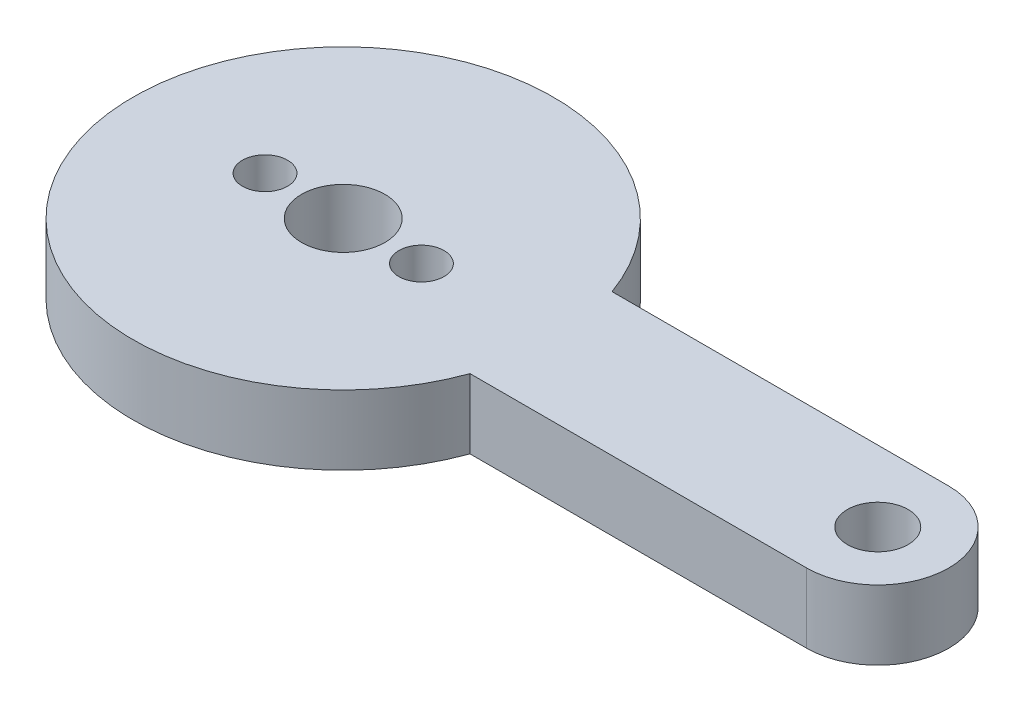
ISO-10303-21;
HEADER;
FILE_DESCRIPTION(('STEP AP214'),'2;1');
FILE_NAME('part.step','',(''),(''),'','','');
FILE_SCHEMA(('AUTOMOTIVE_DESIGN { 1 0 10303 214 1 1 1 1 }'));
ENDSEC;
DATA;
#1=APPLICATION_CONTEXT('core data for automotive mechanical design processes');
#2=APPLICATION_PROTOCOL_DEFINITION('international standard','automotive_design',2000,#1);
#3=PRODUCT_CONTEXT('',#1,'mechanical');
#4=PRODUCT('Part','Part','',(#3));
#5=PRODUCT_RELATED_PRODUCT_CATEGORY('part','',(#4));
#6=PRODUCT_DEFINITION_FORMATION('','',#4);
#7=PRODUCT_DEFINITION_CONTEXT('part definition',#1,'design');
#8=PRODUCT_DEFINITION('design','',#6,#7);
#9=PRODUCT_DEFINITION_SHAPE('','',#8);
#10=(LENGTH_UNIT() NAMED_UNIT(*) SI_UNIT(.MILLI.,.METRE.));
#11=(NAMED_UNIT(*) PLANE_ANGLE_UNIT() SI_UNIT($,.RADIAN.));
#12=(NAMED_UNIT(*) SI_UNIT($,.STERADIAN.) SOLID_ANGLE_UNIT());
#13=UNCERTAINTY_MEASURE_WITH_UNIT(LENGTH_MEASURE(1.E-05),#10,'distance_accuracy_value','');
#14=(GEOMETRIC_REPRESENTATION_CONTEXT(3) GLOBAL_UNCERTAINTY_ASSIGNED_CONTEXT((#13)) GLOBAL_UNIT_ASSIGNED_CONTEXT((#10,
#11,#12)) REPRESENTATION_CONTEXT('',''));
#15=CARTESIAN_POINT('',(0.,0.,0.));
#16=DIRECTION('',(0.,0.,1.));
#17=DIRECTION('',(1.,0.,0.));
#18=AXIS2_PLACEMENT_3D('',#15,#16,#17);
#19=CARTESIAN_POINT('',(30.75,4.,0.));
#20=DIRECTION('',(0.,-1.,0.));
#21=DIRECTION('',(0.,0.,-1.));
#22=AXIS2_PLACEMENT_3D('',#19,#20,#21);
#23=CYLINDRICAL_SURFACE('',#22,4.08510948894802);
#24=CARTESIAN_POINT('',(30.75,0.,0.));
#25=DIRECTION('',(0.,1.,0.));
#26=DIRECTION('',(0.,0.,1.));
#27=AXIS2_PLACEMENT_3D('',#24,#25,#26);
#28=CIRCLE('',#27,4.08510948894802);
#29=CARTESIAN_POINT('',(30.75,0.,-4.08510948894802));
#30=VERTEX_POINT('',#29);
#31=CARTESIAN_POINT('',(30.75,0.,4.08510948894802));
#32=VERTEX_POINT('',#31);
#33=EDGE_CURVE('E112',#30,#32,#28,.F.);
#34=ORIENTED_EDGE('',*,*,#33,.F.);
#35=DIRECTION('',(0.,-1.,0.));
#36=VECTOR('',#35,1.);
#37=CARTESIAN_POINT('',(30.75,4.,-4.08510948894802));
#38=LINE('',#37,#36);
#39=CARTESIAN_POINT('',(30.75,4.,-4.08510948894802));
#40=VERTEX_POINT('',#39);
#41=EDGE_CURVE('E11',#40,#30,#38,.T.);
#42=ORIENTED_EDGE('',*,*,#41,.F.);
#43=CARTESIAN_POINT('',(30.75,4.,0.));
#44=DIRECTION('',(0.,1.,0.));
#45=DIRECTION('',(0.,0.,1.));
#46=AXIS2_PLACEMENT_3D('',#43,#44,#45);
#47=CIRCLE('',#46,4.08510948894802);
#48=CARTESIAN_POINT('',(30.75,4.,4.08510948894802));
#49=VERTEX_POINT('',#48);
#50=EDGE_CURVE('E102',#40,#49,#47,.F.);
#51=ORIENTED_EDGE('',*,*,#50,.T.);
#52=DIRECTION('',(0.,-1.,0.));
#53=VECTOR('',#52,1.);
#54=CARTESIAN_POINT('',(30.75,4.,4.08510948894802));
#55=LINE('',#54,#53);
#56=EDGE_CURVE('E60',#49,#32,#55,.T.);
#57=ORIENTED_EDGE('',*,*,#56,.T.);
#58=EDGE_LOOP('',(#34,#42,#51,#57));
#59=FACE_BOUND('',#58,.T.);
#60=ADVANCED_FACE('F43',(#59),#23,.T.);
#61=CARTESIAN_POINT('',(0.,4.,-4.08510948894803));
#62=DIRECTION('',(0.,0.,-1.));
#63=DIRECTION('',(-1.,0.,0.));
#64=AXIS2_PLACEMENT_3D('',#61,#62,#63);
#65=PLANE('',#64);
#66=DIRECTION('',(1.,0.,0.));
#67=VECTOR('',#66,1.);
#68=CARTESIAN_POINT('',(0.,0.,-4.08510948894803));
#69=LINE('',#68,#67);
#70=CARTESIAN_POINT('',(11.3789270348002,0.,-4.08510948894803));
#71=VERTEX_POINT('',#70);
#72=EDGE_CURVE('E92',#71,#30,#69,.T.);
#73=ORIENTED_EDGE('',*,*,#72,.F.);
#74=DIRECTION('',(0.,-1.,0.));
#75=VECTOR('',#74,1.);
#76=CARTESIAN_POINT('',(11.3789270348002,4.,-4.08510948894803));
#77=LINE('',#76,#75);
#78=CARTESIAN_POINT('',(11.3789270348002,4.,-4.08510948894803));
#79=VERTEX_POINT('',#78);
#80=EDGE_CURVE('E52',#79,#71,#77,.T.);
#81=ORIENTED_EDGE('',*,*,#80,.F.);
#82=DIRECTION('',(1.,0.,0.));
#83=VECTOR('',#82,1.);
#84=CARTESIAN_POINT('',(0.,4.,-4.08510948894803));
#85=LINE('',#84,#83);
#86=EDGE_CURVE('E90',#79,#40,#85,.T.);
#87=ORIENTED_EDGE('',*,*,#86,.T.);
#88=ORIENTED_EDGE('',*,*,#41,.T.);
#89=EDGE_LOOP('',(#73,#81,#87,#88));
#90=FACE_BOUND('',#89,.T.);
#91=ADVANCED_FACE('F88',(#90),#65,.T.);
#92=CARTESIAN_POINT('',(0.,4.,0.));
#93=DIRECTION('',(0.,-1.,0.));
#94=DIRECTION('',(0.,0.,-1.));
#95=AXIS2_PLACEMENT_3D('',#92,#93,#94);
#96=CYLINDRICAL_SURFACE('',#95,12.09);
#97=CARTESIAN_POINT('',(0.,0.,0.));
#98=DIRECTION('',(0.,1.,0.));
#99=DIRECTION('',(0.,0.,1.));
#100=AXIS2_PLACEMENT_3D('',#97,#98,#99);
#101=CIRCLE('',#100,12.09);
#102=CARTESIAN_POINT('',(11.3789270348002,0.,4.08510948894802));
#103=VERTEX_POINT('',#102);
#104=EDGE_CURVE('E116',#71,#103,#101,.T.);
#105=ORIENTED_EDGE('',*,*,#104,.T.);
#106=DIRECTION('',(0.,-1.,0.));
#107=VECTOR('',#106,1.);
#108=CARTESIAN_POINT('',(11.3789270348002,4.,4.08510948894802));
#109=LINE('',#108,#107);
#110=CARTESIAN_POINT('',(11.3789270348002,4.,4.08510948894802));
#111=VERTEX_POINT('',#110);
#112=EDGE_CURVE('E74',#111,#103,#109,.T.);
#113=ORIENTED_EDGE('',*,*,#112,.F.);
#114=CARTESIAN_POINT('',(0.,4.,0.));
#115=DIRECTION('',(0.,1.,0.));
#116=DIRECTION('',(0.,0.,1.));
#117=AXIS2_PLACEMENT_3D('',#114,#115,#116);
#118=CIRCLE('',#117,12.09);
#119=EDGE_CURVE('E95',#79,#111,#118,.T.);
#120=ORIENTED_EDGE('',*,*,#119,.F.);
#121=ORIENTED_EDGE('',*,*,#80,.T.);
#122=EDGE_LOOP('',(#105,#113,#120,#121));
#123=FACE_BOUND('',#122,.T.);
#124=ADVANCED_FACE('F96',(#123),#96,.T.);
#125=CARTESIAN_POINT('',(0.,4.,4.08510948894802));
#126=DIRECTION('',(0.,0.,1.));
#127=DIRECTION('',(1.,0.,0.));
#128=AXIS2_PLACEMENT_3D('',#125,#126,#127);
#129=PLANE('',#128);
#130=DIRECTION('',(-1.,0.,0.));
#131=VECTOR('',#130,1.);
#132=CARTESIAN_POINT('',(0.,0.,4.08510948894802));
#133=LINE('',#132,#131);
#134=EDGE_CURVE('E118',#32,#103,#133,.T.);
#135=ORIENTED_EDGE('',*,*,#134,.F.);
#136=ORIENTED_EDGE('',*,*,#56,.F.);
#137=DIRECTION('',(-1.,0.,0.));
#138=VECTOR('',#137,1.);
#139=CARTESIAN_POINT('',(0.,4.,4.08510948894802));
#140=LINE('',#139,#138);
#141=EDGE_CURVE('E99',#49,#111,#140,.T.);
#142=ORIENTED_EDGE('',*,*,#141,.T.);
#143=ORIENTED_EDGE('',*,*,#112,.T.);
#144=EDGE_LOOP('',(#135,#136,#142,#143));
#145=FACE_BOUND('',#144,.T.);
#146=ADVANCED_FACE('F181',(#145),#129,.T.);
#147=CARTESIAN_POINT('',(30.75,4.,0.));
#148=DIRECTION('',(0.,-1.,0.));
#149=DIRECTION('',(0.,0.,-1.));
#150=AXIS2_PLACEMENT_3D('',#147,#148,#149);
#151=CYLINDRICAL_SURFACE('',#150,1.75);
#152=CARTESIAN_POINT('',(30.75,4.,0.));
#153=DIRECTION('',(0.,1.,0.));
#154=DIRECTION('',(0.,0.,1.));
#155=AXIS2_PLACEMENT_3D('',#152,#153,#154);
#156=CIRCLE('',#155,1.75);
#157=CARTESIAN_POINT('',(30.75,4.,1.75));
#158=VERTEX_POINT('',#157);
#159=EDGE_CURVE('E104',#158,#158,#156,.T.);
#160=ORIENTED_EDGE('',*,*,#159,.T.);
#161=EDGE_LOOP('',(#160));
#162=FACE_BOUND('',#161,.T.);
#163=CARTESIAN_POINT('',(30.75,0.,0.));
#164=DIRECTION('',(0.,1.,0.));
#165=DIRECTION('',(0.,0.,1.));
#166=AXIS2_PLACEMENT_3D('',#163,#164,#165);
#167=CIRCLE('',#166,1.75);
#168=CARTESIAN_POINT('',(30.75,0.,1.75));
#169=VERTEX_POINT('',#168);
#170=EDGE_CURVE('E109',#169,#169,#167,.T.);
#171=ORIENTED_EDGE('',*,*,#170,.F.);
#172=EDGE_LOOP('',(#171));
#173=FACE_BOUND('',#172,.T.);
#174=ADVANCED_FACE('F45',(#162,#173),#151,.F.);
#175=CARTESIAN_POINT('',(0.,4.,0.));
#176=DIRECTION('',(0.,1.,0.));
#177=DIRECTION('',(0.,0.,1.));
#178=AXIS2_PLACEMENT_3D('',#175,#176,#177);
#179=PLANE('',#178);
#180=CARTESIAN_POINT('',(-4.5,4.,0.));
#181=DIRECTION('',(0.,1.,0.));
#182=DIRECTION('',(0.,0.,1.));
#183=AXIS2_PLACEMENT_3D('',#180,#181,#182);
#184=CIRCLE('',#183,1.3);
#185=CARTESIAN_POINT('',(-4.5,4.,1.3));
#186=VERTEX_POINT('',#185);
#187=EDGE_CURVE('E133',#186,#186,#184,.T.);
#188=ORIENTED_EDGE('',*,*,#187,.F.);
#189=EDGE_LOOP('',(#188));
#190=FACE_BOUND('',#189,.T.);
#191=CARTESIAN_POINT('',(4.5,4.,0.));
#192=DIRECTION('',(0.,1.,0.));
#193=DIRECTION('',(0.,0.,1.));
#194=AXIS2_PLACEMENT_3D('',#191,#192,#193);
#195=CIRCLE('',#194,1.3);
#196=CARTESIAN_POINT('',(4.5,4.,1.3));
#197=VERTEX_POINT('',#196);
#198=EDGE_CURVE('E139',#197,#197,#195,.T.);
#199=ORIENTED_EDGE('',*,*,#198,.F.);
#200=EDGE_LOOP('',(#199));
#201=FACE_BOUND('',#200,.T.);
#202=CARTESIAN_POINT('',(0.,4.,0.));
#203=DIRECTION('',(0.,1.,0.));
#204=DIRECTION('',(0.,0.,1.));
#205=AXIS2_PLACEMENT_3D('',#202,#203,#204);
#206=CIRCLE('',#205,2.4);
#207=CARTESIAN_POINT('',(0.,4.,2.4));
#208=VERTEX_POINT('',#207);
#209=EDGE_CURVE('E127',#208,#208,#206,.T.);
#210=ORIENTED_EDGE('',*,*,#209,.F.);
#211=EDGE_LOOP('',(#210));
#212=FACE_BOUND('',#211,.T.);
#213=ORIENTED_EDGE('',*,*,#159,.F.);
#214=EDGE_LOOP('',(#213));
#215=FACE_BOUND('',#214,.T.);
#216=ORIENTED_EDGE('',*,*,#50,.F.);
#217=ORIENTED_EDGE('',*,*,#86,.F.);
#218=ORIENTED_EDGE('',*,*,#119,.T.);
#219=ORIENTED_EDGE('',*,*,#141,.F.);
#220=EDGE_LOOP('',(#216,#217,#218,#219));
#221=FACE_BOUND('',#220,.T.);
#222=ADVANCED_FACE('F101',(#190,#201,#212,#215,#221),#179,.T.);
#223=CARTESIAN_POINT('',(0.,0.,0.));
#224=DIRECTION('',(0.,1.,0.));
#225=DIRECTION('',(0.,0.,1.));
#226=AXIS2_PLACEMENT_3D('',#223,#224,#225);
#227=PLANE('',#226);
#228=CARTESIAN_POINT('',(-4.5,0.,0.));
#229=DIRECTION('',(0.,1.,0.));
#230=DIRECTION('',(0.,0.,1.));
#231=AXIS2_PLACEMENT_3D('',#228,#229,#230);
#232=CIRCLE('',#231,1.3);
#233=CARTESIAN_POINT('',(-4.5,0.,1.3));
#234=VERTEX_POINT('',#233);
#235=EDGE_CURVE('E136',#234,#234,#232,.T.);
#236=ORIENTED_EDGE('',*,*,#235,.T.);
#237=EDGE_LOOP('',(#236));
#238=FACE_BOUND('',#237,.T.);
#239=CARTESIAN_POINT('',(4.5,0.,0.));
#240=DIRECTION('',(0.,1.,0.));
#241=DIRECTION('',(0.,0.,1.));
#242=AXIS2_PLACEMENT_3D('',#239,#240,#241);
#243=CIRCLE('',#242,1.3);
#244=CARTESIAN_POINT('',(4.5,0.,1.3));
#245=VERTEX_POINT('',#244);
#246=EDGE_CURVE('E130',#245,#245,#243,.T.);
#247=ORIENTED_EDGE('',*,*,#246,.T.);
#248=EDGE_LOOP('',(#247));
#249=FACE_BOUND('',#248,.T.);
#250=CARTESIAN_POINT('',(0.,0.,0.));
#251=DIRECTION('',(0.,1.,0.));
#252=DIRECTION('',(0.,0.,1.));
#253=AXIS2_PLACEMENT_3D('',#250,#251,#252);
#254=CIRCLE('',#253,2.4);
#255=CARTESIAN_POINT('',(0.,0.,2.4));
#256=VERTEX_POINT('',#255);
#257=EDGE_CURVE('E113',#256,#256,#254,.T.);
#258=ORIENTED_EDGE('',*,*,#257,.T.);
#259=EDGE_LOOP('',(#258));
#260=FACE_BOUND('',#259,.T.);
#261=ORIENTED_EDGE('',*,*,#170,.T.);
#262=EDGE_LOOP('',(#261));
#263=FACE_BOUND('',#262,.T.);
#264=ORIENTED_EDGE('',*,*,#33,.T.);
#265=ORIENTED_EDGE('',*,*,#134,.T.);
#266=ORIENTED_EDGE('',*,*,#104,.F.);
#267=ORIENTED_EDGE('',*,*,#72,.T.);
#268=EDGE_LOOP('',(#264,#265,#266,#267));
#269=FACE_BOUND('',#268,.T.);
#270=ADVANCED_FACE('F145',(#238,#249,#260,#263,#269),#227,.F.);
#271=CARTESIAN_POINT('',(0.,0.,0.));
#272=DIRECTION('',(0.,1.,0.));
#273=DIRECTION('',(0.,0.,1.));
#274=AXIS2_PLACEMENT_3D('',#271,#272,#273);
#275=CYLINDRICAL_SURFACE('',#274,2.4);
#276=ORIENTED_EDGE('',*,*,#257,.F.);
#277=EDGE_LOOP('',(#276));
#278=FACE_BOUND('',#277,.T.);
#279=ORIENTED_EDGE('',*,*,#209,.T.);
#280=EDGE_LOOP('',(#279));
#281=FACE_BOUND('',#280,.T.);
#282=ADVANCED_FACE('F152',(#278,#281),#275,.F.);
#283=CARTESIAN_POINT('',(4.5,0.,0.));
#284=DIRECTION('',(0.,1.,0.));
#285=DIRECTION('',(0.,0.,1.));
#286=AXIS2_PLACEMENT_3D('',#283,#284,#285);
#287=CYLINDRICAL_SURFACE('',#286,1.3);
#288=ORIENTED_EDGE('',*,*,#246,.F.);
#289=EDGE_LOOP('',(#288));
#290=FACE_BOUND('',#289,.T.);
#291=ORIENTED_EDGE('',*,*,#198,.T.);
#292=EDGE_LOOP('',(#291));
#293=FACE_BOUND('',#292,.T.);
#294=ADVANCED_FACE('F148',(#290,#293),#287,.F.);
#295=CARTESIAN_POINT('',(-4.5,0.,0.));
#296=DIRECTION('',(0.,1.,0.));
#297=DIRECTION('',(0.,0.,1.));
#298=AXIS2_PLACEMENT_3D('',#295,#296,#297);
#299=CYLINDRICAL_SURFACE('',#298,1.3);
#300=ORIENTED_EDGE('',*,*,#235,.F.);
#301=EDGE_LOOP('',(#300));
#302=FACE_BOUND('',#301,.T.);
#303=ORIENTED_EDGE('',*,*,#187,.T.);
#304=EDGE_LOOP('',(#303));
#305=FACE_BOUND('',#304,.T.);
#306=ADVANCED_FACE('F151',(#302,#305),#299,.F.);
#307=CLOSED_SHELL('',(#60,#91,#124,#146,#174,#222,#270,#282,#294,#306));
#308=MANIFOLD_SOLID_BREP('B2',#307);
#309=ADVANCED_BREP_SHAPE_REPRESENTATION('',(#18,#308),#14);
#310=SHAPE_DEFINITION_REPRESENTATION(#9,#309);
ENDSEC;
END-ISO-10303-21;
